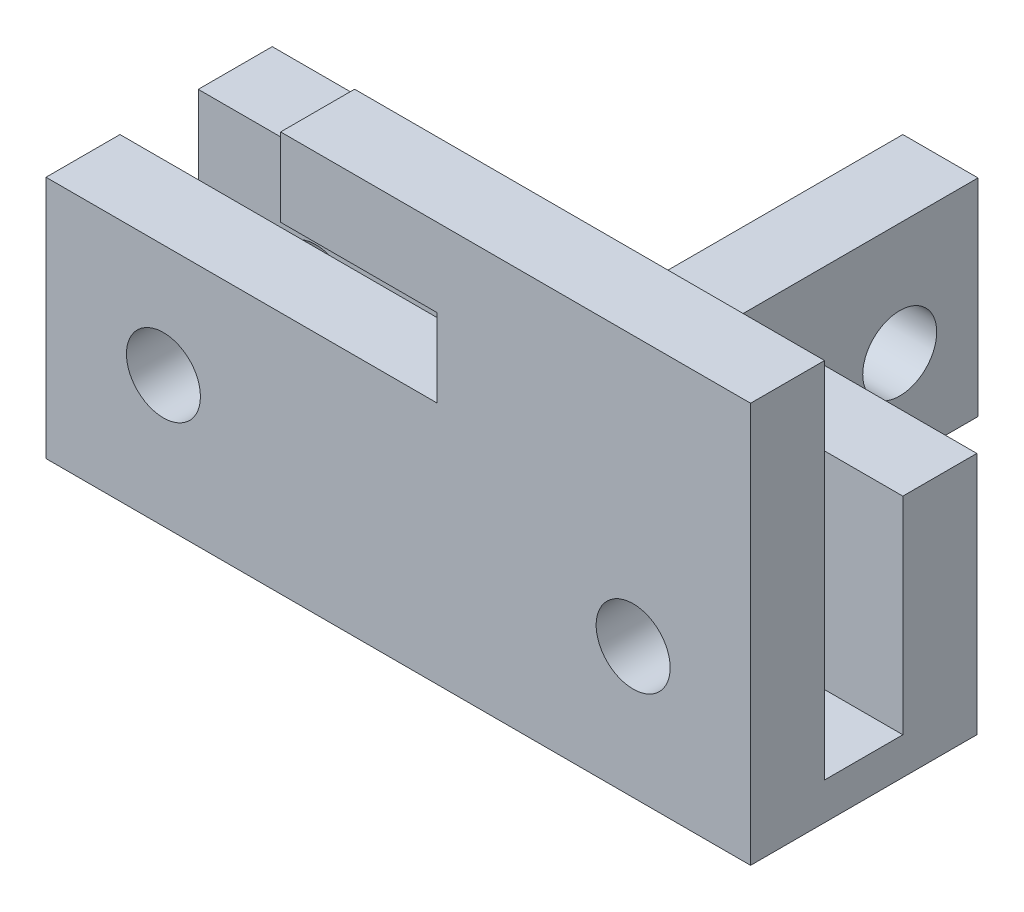
ISO-10303-21;
HEADER;
FILE_DESCRIPTION(('STEP AP214'),'2;1');
FILE_NAME('part.step','',(''),(''),'','','');
FILE_SCHEMA(('AUTOMOTIVE_DESIGN { 1 0 10303 214 1 1 1 1 }'));
ENDSEC;
DATA;
#1=APPLICATION_CONTEXT('core data for automotive mechanical design processes');
#2=APPLICATION_PROTOCOL_DEFINITION('international standard','automotive_design',2000,#1);
#3=PRODUCT_CONTEXT('',#1,'mechanical');
#4=PRODUCT('Part','Part','',(#3));
#5=PRODUCT_RELATED_PRODUCT_CATEGORY('part','',(#4));
#6=PRODUCT_DEFINITION_FORMATION('','',#4);
#7=PRODUCT_DEFINITION_CONTEXT('part definition',#1,'design');
#8=PRODUCT_DEFINITION('design','',#6,#7);
#9=PRODUCT_DEFINITION_SHAPE('','',#8);
#10=(LENGTH_UNIT() NAMED_UNIT(*) SI_UNIT(.MILLI.,.METRE.));
#11=(NAMED_UNIT(*) PLANE_ANGLE_UNIT() SI_UNIT($,.RADIAN.));
#12=(NAMED_UNIT(*) SI_UNIT($,.STERADIAN.) SOLID_ANGLE_UNIT());
#13=UNCERTAINTY_MEASURE_WITH_UNIT(LENGTH_MEASURE(1.E-05),#10,'distance_accuracy_value','');
#14=(GEOMETRIC_REPRESENTATION_CONTEXT(3) GLOBAL_UNCERTAINTY_ASSIGNED_CONTEXT((#13)) GLOBAL_UNIT_ASSIGNED_CONTEXT((#10,
#11,#12)) REPRESENTATION_CONTEXT('',''));
#15=CARTESIAN_POINT('',(0.,0.,0.));
#16=DIRECTION('',(0.,0.,1.));
#17=DIRECTION('',(1.,0.,0.));
#18=AXIS2_PLACEMENT_3D('',#15,#16,#17);
#19=CARTESIAN_POINT('',(14.2875,0.,-9.175));
#20=DIRECTION('',(0.,0.,1.));
#21=DIRECTION('',(0.,-1.,0.));
#22=AXIS2_PLACEMENT_3D('',#19,#20,#21);
#23=PLANE('',#22);
#24=CARTESIAN_POINT('',(-9.525,5.31,-9.175));
#25=DIRECTION('',(0.,0.,1.));
#26=DIRECTION('',(1.,0.,0.));
#27=AXIS2_PLACEMENT_3D('',#24,#25,#26);
#28=CIRCLE('',#27,1.5);
#29=CARTESIAN_POINT('',(-8.025,5.31,-9.175));
#30=VERTEX_POINT('',#29);
#31=EDGE_CURVE('E294',#30,#30,#28,.F.);
#32=ORIENTED_EDGE('',*,*,#31,.F.);
#33=EDGE_LOOP('',(#32));
#34=FACE_BOUND('',#33,.T.);
#35=CARTESIAN_POINT('',(9.525,5.31,-9.175));
#36=DIRECTION('',(0.,0.,1.));
#37=DIRECTION('',(1.,0.,0.));
#38=AXIS2_PLACEMENT_3D('',#35,#36,#37);
#39=CIRCLE('',#38,1.5);
#40=CARTESIAN_POINT('',(11.025,5.31,-9.175));
#41=VERTEX_POINT('',#40);
#42=EDGE_CURVE('E295',#41,#41,#39,.F.);
#43=ORIENTED_EDGE('',*,*,#42,.F.);
#44=EDGE_LOOP('',(#43));
#45=FACE_BOUND('',#44,.T.);
#46=DIRECTION('',(-1.,0.,0.));
#47=VECTOR('',#46,1.);
#48=CARTESIAN_POINT('',(4.6355,1.5,-9.175));
#49=LINE('',#48,#47);
#50=CARTESIAN_POINT('',(4.6355,1.5,-9.175));
#51=VERTEX_POINT('',#50);
#52=CARTESIAN_POINT('',(1.5875,1.5,-9.175));
#53=VERTEX_POINT('',#52);
#54=EDGE_CURVE('E264',#51,#53,#49,.T.);
#55=ORIENTED_EDGE('',*,*,#54,.F.);
#56=DIRECTION('',(0.,-1.,0.));
#57=VECTOR('',#56,1.);
#58=CARTESIAN_POINT('',(4.6355,9.882,-9.175));
#59=LINE('',#58,#57);
#60=CARTESIAN_POINT('',(4.6355,9.882,-9.175));
#61=VERTEX_POINT('',#60);
#62=EDGE_CURVE('E65',#61,#51,#59,.T.);
#63=ORIENTED_EDGE('',*,*,#62,.F.);
#64=DIRECTION('',(-1.,0.,0.));
#65=VECTOR('',#64,1.);
#66=CARTESIAN_POINT('',(14.2875,9.882,-9.175));
#67=LINE('',#66,#65);
#68=CARTESIAN_POINT('',(14.2875,9.882,-9.175));
#69=VERTEX_POINT('',#68);
#70=EDGE_CURVE('E386',#69,#61,#67,.T.);
#71=ORIENTED_EDGE('',*,*,#70,.F.);
#72=DIRECTION('',(0.,1.,0.));
#73=VECTOR('',#72,1.);
#74=CARTESIAN_POINT('',(14.2875,0.,-9.175));
#75=LINE('',#74,#73);
#76=CARTESIAN_POINT('',(14.2875,0.,-9.175));
#77=VERTEX_POINT('',#76);
#78=EDGE_CURVE('E330',#77,#69,#75,.T.);
#79=ORIENTED_EDGE('',*,*,#78,.F.);
#80=DIRECTION('',(-1.,0.,0.));
#81=VECTOR('',#80,1.);
#82=CARTESIAN_POINT('',(14.2875,0.,-9.175));
#83=LINE('',#82,#81);
#84=CARTESIAN_POINT('',(-14.2875,0.,-9.175));
#85=VERTEX_POINT('',#84);
#86=EDGE_CURVE('E389',#77,#85,#83,.T.);
#87=ORIENTED_EDGE('',*,*,#86,.T.);
#88=DIRECTION('',(0.,1.,0.));
#89=VECTOR('',#88,1.);
#90=CARTESIAN_POINT('',(-14.2875,0.,-9.175));
#91=LINE('',#90,#89);
#92=CARTESIAN_POINT('',(-14.2875,9.882,-9.175));
#93=VERTEX_POINT('',#92);
#94=EDGE_CURVE('E358',#85,#93,#91,.T.);
#95=ORIENTED_EDGE('',*,*,#94,.T.);
#96=CARTESIAN_POINT('',(-1.5875,9.882,-9.175));
#97=VERTEX_POINT('',#96);
#98=EDGE_CURVE('E385',#97,#93,#67,.T.);
#99=ORIENTED_EDGE('',*,*,#98,.F.);
#100=DIRECTION('',(0.,1.,0.));
#101=VECTOR('',#100,1.);
#102=CARTESIAN_POINT('',(-1.5875,9.882,-9.175));
#103=LINE('',#102,#101);
#104=CARTESIAN_POINT('',(-1.5875,1.5,-9.175));
#105=VERTEX_POINT('',#104);
#106=EDGE_CURVE('E269',#105,#97,#103,.T.);
#107=ORIENTED_EDGE('',*,*,#106,.F.);
#108=DIRECTION('',(-1.,0.,0.));
#109=VECTOR('',#108,1.);
#110=CARTESIAN_POINT('',(1.5875,1.5,-9.175));
#111=LINE('',#110,#109);
#112=EDGE_CURVE('E268',#53,#105,#111,.T.);
#113=ORIENTED_EDGE('',*,*,#112,.F.);
#114=EDGE_LOOP('',(#55,#63,#71,#79,#87,#95,#99,#107,#113));
#115=FACE_BOUND('',#114,.T.);
#116=ADVANCED_FACE('F47',(#34,#45,#115),#23,.F.);
#117=CARTESIAN_POINT('',(14.2875,9.882,0.));
#118=DIRECTION('',(0.,1.,0.));
#119=DIRECTION('',(0.,0.,1.));
#120=AXIS2_PLACEMENT_3D('',#117,#118,#119);
#121=PLANE('',#120);
#122=DIRECTION('',(0.,0.,-1.));
#123=VECTOR('',#122,1.);
#124=CARTESIAN_POINT('',(-1.5875,9.882,0.00100000000000273));
#125=LINE('',#124,#123);
#126=CARTESIAN_POINT('',(-1.5875,9.882,-6.175));
#127=VERTEX_POINT('',#126);
#128=EDGE_CURVE('E284',#127,#97,#125,.T.);
#129=ORIENTED_EDGE('',*,*,#128,.T.);
#130=ORIENTED_EDGE('',*,*,#98,.T.);
#131=DIRECTION('',(0.,0.,-1.));
#132=VECTOR('',#131,1.);
#133=CARTESIAN_POINT('',(-14.2875,9.882,0.));
#134=LINE('',#133,#132);
#135=CARTESIAN_POINT('',(-14.2875,9.882,-6.175));
#136=VERTEX_POINT('',#135);
#137=EDGE_CURVE('E362',#136,#93,#134,.T.);
#138=ORIENTED_EDGE('',*,*,#137,.F.);
#139=DIRECTION('',(-1.,0.,0.));
#140=VECTOR('',#139,1.);
#141=CARTESIAN_POINT('',(14.2875,9.882,-6.175));
#142=LINE('',#141,#140);
#143=EDGE_CURVE('E380',#127,#136,#142,.T.);
#144=ORIENTED_EDGE('',*,*,#143,.F.);
#145=EDGE_LOOP('',(#129,#130,#138,#144));
#146=FACE_BOUND('',#145,.T.);
#147=ADVANCED_FACE('F415',(#146),#121,.T.);
#148=CARTESIAN_POINT('',(14.2875,0.,-6.175));
#149=DIRECTION('',(0.,0.,1.));
#150=DIRECTION('',(0.,-1.,0.));
#151=AXIS2_PLACEMENT_3D('',#148,#149,#150);
#152=PLANE('',#151);
#153=DIRECTION('',(0.,1.,0.));
#154=VECTOR('',#153,1.);
#155=CARTESIAN_POINT('',(-1.5875,9.882,-6.175));
#156=LINE('',#155,#154);
#157=CARTESIAN_POINT('',(-1.5875,1.5,-6.175));
#158=VERTEX_POINT('',#157);
#159=EDGE_CURVE('E280',#158,#127,#156,.T.);
#160=ORIENTED_EDGE('',*,*,#159,.T.);
#161=ORIENTED_EDGE('',*,*,#143,.T.);
#162=DIRECTION('',(0.,1.,0.));
#163=VECTOR('',#162,1.);
#164=CARTESIAN_POINT('',(-14.2875,0.,-6.175));
#165=LINE('',#164,#163);
#166=CARTESIAN_POINT('',(-14.2875,1.5,-6.175));
#167=VERTEX_POINT('',#166);
#168=EDGE_CURVE('E366',#167,#136,#165,.T.);
#169=ORIENTED_EDGE('',*,*,#168,.F.);
#170=DIRECTION('',(-1.,0.,0.));
#171=VECTOR('',#170,1.);
#172=CARTESIAN_POINT('',(14.2875,1.5,-6.175));
#173=LINE('',#172,#171);
#174=EDGE_CURVE('E375',#158,#167,#173,.T.);
#175=ORIENTED_EDGE('',*,*,#174,.F.);
#176=EDGE_LOOP('',(#160,#161,#169,#175));
#177=FACE_BOUND('',#176,.T.);
#178=CARTESIAN_POINT('',(-9.525,5.31,-6.175));
#179=DIRECTION('',(0.,0.,1.));
#180=DIRECTION('',(0.,-1.,0.));
#181=AXIS2_PLACEMENT_3D('',#178,#179,#180);
#182=CIRCLE('',#181,1.5);
#183=CARTESIAN_POINT('',(-9.525,3.81,-6.175));
#184=VERTEX_POINT('',#183);
#185=EDGE_CURVE('E299',#184,#184,#182,.F.);
#186=ORIENTED_EDGE('',*,*,#185,.T.);
#187=EDGE_LOOP('',(#186));
#188=FACE_BOUND('',#187,.T.);
#189=ADVANCED_FACE('F402',(#177,#188),#152,.T.);
#190=CARTESIAN_POINT('',(14.2875,0.,-3.));
#191=DIRECTION('',(0.,0.,1.));
#192=DIRECTION('',(0.,-1.,0.));
#193=AXIS2_PLACEMENT_3D('',#190,#191,#192);
#194=PLANE('',#193);
#195=CARTESIAN_POINT('',(9.525,5.31,-3.));
#196=DIRECTION('',(0.,0.,1.));
#197=DIRECTION('',(0.,-1.,0.));
#198=AXIS2_PLACEMENT_3D('',#195,#196,#197);
#199=CIRCLE('',#198,1.5);
#200=CARTESIAN_POINT('',(9.525,3.81,-3.));
#201=VERTEX_POINT('',#200);
#202=EDGE_CURVE('E315',#201,#201,#199,.F.);
#203=ORIENTED_EDGE('',*,*,#202,.F.);
#204=EDGE_LOOP('',(#203));
#205=FACE_BOUND('',#204,.T.);
#206=CARTESIAN_POINT('',(-9.525,5.31,-3.));
#207=DIRECTION('',(0.,0.,1.));
#208=DIRECTION('',(0.,-1.,0.));
#209=AXIS2_PLACEMENT_3D('',#206,#207,#208);
#210=CIRCLE('',#209,1.5);
#211=CARTESIAN_POINT('',(-9.525,3.81,-3.));
#212=VERTEX_POINT('',#211);
#213=EDGE_CURVE('E311',#212,#212,#210,.F.);
#214=ORIENTED_EDGE('',*,*,#213,.F.);
#215=EDGE_LOOP('',(#214));
#216=FACE_BOUND('',#215,.T.);
#217=DIRECTION('',(0.,1.,0.));
#218=VECTOR('',#217,1.);
#219=CARTESIAN_POINT('',(-14.2875,0.,-3.));
#220=LINE('',#219,#218);
#221=CARTESIAN_POINT('',(-14.2875,1.5,-3.));
#222=VERTEX_POINT('',#221);
#223=CARTESIAN_POINT('',(-14.2875,9.882,-3.));
#224=VERTEX_POINT('',#223);
#225=EDGE_CURVE('E319',#222,#224,#220,.T.);
#226=ORIENTED_EDGE('',*,*,#225,.T.);
#227=DIRECTION('',(-1.,0.,0.));
#228=VECTOR('',#227,1.);
#229=CARTESIAN_POINT('',(14.2875,9.882,-3.));
#230=LINE('',#229,#228);
#231=CARTESIAN_POINT('',(1.5785,9.882,-3.));
#232=VERTEX_POINT('',#231);
#233=EDGE_CURVE('E12',#232,#224,#230,.T.);
#234=ORIENTED_EDGE('',*,*,#233,.F.);
#235=DIRECTION('',(0.,1.,0.));
#236=VECTOR('',#235,1.);
#237=CARTESIAN_POINT('',(1.5785,0.,-3.));
#238=LINE('',#237,#236);
#239=CARTESIAN_POINT('',(1.5785,13.057,-3.));
#240=VERTEX_POINT('',#239);
#241=EDGE_CURVE('E226',#232,#240,#238,.T.);
#242=ORIENTED_EDGE('',*,*,#241,.T.);
#243=DIRECTION('',(-1.,0.,0.));
#244=VECTOR('',#243,1.);
#245=CARTESIAN_POINT('',(0.,13.057,-3.));
#246=LINE('',#245,#244);
#247=CARTESIAN_POINT('',(-4.7715,13.057,-3.));
#248=VERTEX_POINT('',#247);
#249=EDGE_CURVE('E185',#240,#248,#246,.T.);
#250=ORIENTED_EDGE('',*,*,#249,.T.);
#251=DIRECTION('',(0.,-1.,0.));
#252=VECTOR('',#251,1.);
#253=CARTESIAN_POINT('',(-4.7715,0.,-3.));
#254=LINE('',#253,#252);
#255=CARTESIAN_POINT('',(-4.7715,16.232,-3.));
#256=VERTEX_POINT('',#255);
#257=EDGE_CURVE('E504',#256,#248,#254,.T.);
#258=ORIENTED_EDGE('',*,*,#257,.F.);
#259=DIRECTION('',(1.,0.,0.));
#260=VECTOR('',#259,1.);
#261=CARTESIAN_POINT('',(0.,16.232,-3.));
#262=LINE('',#261,#260);
#263=CARTESIAN_POINT('',(14.2875,16.232,-2.99999999999999));
#264=VERTEX_POINT('',#263);
#265=EDGE_CURVE('E216',#256,#264,#262,.T.);
#266=ORIENTED_EDGE('',*,*,#265,.T.);
#267=DIRECTION('',(0.,1.,0.));
#268=VECTOR('',#267,1.);
#269=CARTESIAN_POINT('',(14.2875,0.,-3.));
#270=LINE('',#269,#268);
#271=CARTESIAN_POINT('',(14.2875,1.5,-3.));
#272=VERTEX_POINT('',#271);
#273=EDGE_CURVE('E320',#272,#264,#270,.T.);
#274=ORIENTED_EDGE('',*,*,#273,.F.);
#275=DIRECTION('',(-1.,0.,0.));
#276=VECTOR('',#275,1.);
#277=CARTESIAN_POINT('',(14.2875,1.5,-3.));
#278=LINE('',#277,#276);
#279=EDGE_CURVE('E344',#272,#222,#278,.T.);
#280=ORIENTED_EDGE('',*,*,#279,.T.);
#281=EDGE_LOOP('',(#226,#234,#242,#250,#258,#266,#274,#280));
#282=FACE_BOUND('',#281,.T.);
#283=ADVANCED_FACE('F49',(#205,#216,#282),#194,.F.);
#284=CARTESIAN_POINT('',(14.2875,9.882,0.));
#285=DIRECTION('',(0.,-1.,0.));
#286=DIRECTION('',(0.,0.,-1.));
#287=AXIS2_PLACEMENT_3D('',#284,#285,#286);
#288=PLANE('',#287);
#289=DIRECTION('',(-1.,0.,0.));
#290=VECTOR('',#289,1.);
#291=CARTESIAN_POINT('',(14.2875,9.882,0.));
#292=LINE('',#291,#290);
#293=CARTESIAN_POINT('',(1.5785,9.882,0.));
#294=VERTEX_POINT('',#293);
#295=CARTESIAN_POINT('',(-14.2875,9.882,0.));
#296=VERTEX_POINT('',#295);
#297=EDGE_CURVE('E57',#294,#296,#292,.T.);
#298=ORIENTED_EDGE('',*,*,#297,.F.);
#299=DIRECTION('',(0.,0.,1.));
#300=VECTOR('',#299,1.);
#301=CARTESIAN_POINT('',(1.5785,9.882,-23.0890014933545));
#302=LINE('',#301,#300);
#303=EDGE_CURVE('E188',#232,#294,#302,.T.);
#304=ORIENTED_EDGE('',*,*,#303,.F.);
#305=ORIENTED_EDGE('',*,*,#233,.T.);
#306=DIRECTION('',(0.,0.,1.));
#307=VECTOR('',#306,1.);
#308=CARTESIAN_POINT('',(-14.2875,9.882,0.));
#309=LINE('',#308,#307);
#310=EDGE_CURVE('E348',#224,#296,#309,.T.);
#311=ORIENTED_EDGE('',*,*,#310,.T.);
#312=EDGE_LOOP('',(#298,#304,#305,#311));
#313=FACE_BOUND('',#312,.T.);
#314=ADVANCED_FACE('F485',(#313),#288,.F.);
#315=CARTESIAN_POINT('',(14.2875,0.,0.));
#316=DIRECTION('',(0.,0.,-1.));
#317=DIRECTION('',(0.,1.,0.));
#318=AXIS2_PLACEMENT_3D('',#315,#316,#317);
#319=PLANE('',#318);
#320=CARTESIAN_POINT('',(9.525,5.31,0.));
#321=DIRECTION('',(0.,0.,1.));
#322=DIRECTION('',(1.,0.,0.));
#323=AXIS2_PLACEMENT_3D('',#320,#321,#322);
#324=CIRCLE('',#323,1.5);
#325=CARTESIAN_POINT('',(11.025,5.31,0.));
#326=VERTEX_POINT('',#325);
#327=EDGE_CURVE('E300',#326,#326,#324,.F.);
#328=ORIENTED_EDGE('',*,*,#327,.T.);
#329=EDGE_LOOP('',(#328));
#330=FACE_BOUND('',#329,.T.);
#331=CARTESIAN_POINT('',(-9.525,5.31,0.));
#332=DIRECTION('',(0.,0.,1.));
#333=DIRECTION('',(1.,0.,0.));
#334=AXIS2_PLACEMENT_3D('',#331,#332,#333);
#335=CIRCLE('',#334,1.5);
#336=CARTESIAN_POINT('',(-8.025,5.31,0.));
#337=VERTEX_POINT('',#336);
#338=EDGE_CURVE('E304',#337,#337,#335,.F.);
#339=ORIENTED_EDGE('',*,*,#338,.T.);
#340=EDGE_LOOP('',(#339));
#341=FACE_BOUND('',#340,.T.);
#342=DIRECTION('',(0.,-1.,0.));
#343=VECTOR('',#342,1.);
#344=CARTESIAN_POINT('',(-14.2875,0.,0.));
#345=LINE('',#344,#343);
#346=CARTESIAN_POINT('',(-14.2875,0.,0.));
#347=VERTEX_POINT('',#346);
#348=EDGE_CURVE('E352',#296,#347,#345,.T.);
#349=ORIENTED_EDGE('',*,*,#348,.T.);
#350=DIRECTION('',(-1.,0.,0.));
#351=VECTOR('',#350,1.);
#352=CARTESIAN_POINT('',(14.2875,0.,0.));
#353=LINE('',#352,#351);
#354=CARTESIAN_POINT('',(14.2875,0.,0.));
#355=VERTEX_POINT('',#354);
#356=EDGE_CURVE('E393',#355,#347,#353,.T.);
#357=ORIENTED_EDGE('',*,*,#356,.F.);
#358=DIRECTION('',(0.,-1.,0.));
#359=VECTOR('',#358,1.);
#360=CARTESIAN_POINT('',(14.2875,0.,0.));
#361=LINE('',#360,#359);
#362=CARTESIAN_POINT('',(14.2875,16.232,0.));
#363=VERTEX_POINT('',#362);
#364=EDGE_CURVE('E323',#363,#355,#361,.T.);
#365=ORIENTED_EDGE('',*,*,#364,.F.);
#366=DIRECTION('',(-1.,0.,0.));
#367=VECTOR('',#366,1.);
#368=CARTESIAN_POINT('',(0.,16.232,0.));
#369=LINE('',#368,#367);
#370=CARTESIAN_POINT('',(-4.7715,16.232,0.));
#371=VERTEX_POINT('',#370);
#372=EDGE_CURVE('E198',#363,#371,#369,.T.);
#373=ORIENTED_EDGE('',*,*,#372,.T.);
#374=DIRECTION('',(0.,1.,0.));
#375=VECTOR('',#374,1.);
#376=CARTESIAN_POINT('',(-4.7715,0.,0.));
#377=LINE('',#376,#375);
#378=CARTESIAN_POINT('',(-4.7715,13.057,0.));
#379=VERTEX_POINT('',#378);
#380=EDGE_CURVE('E189',#379,#371,#377,.T.);
#381=ORIENTED_EDGE('',*,*,#380,.F.);
#382=DIRECTION('',(1.,0.,0.));
#383=VECTOR('',#382,1.);
#384=CARTESIAN_POINT('',(0.,13.057,0.));
#385=LINE('',#384,#383);
#386=CARTESIAN_POINT('',(1.5785,13.057,0.));
#387=VERTEX_POINT('',#386);
#388=EDGE_CURVE('E184',#379,#387,#385,.T.);
#389=ORIENTED_EDGE('',*,*,#388,.T.);
#390=DIRECTION('',(0.,-1.,0.));
#391=VECTOR('',#390,1.);
#392=CARTESIAN_POINT('',(1.5785,0.,0.));
#393=LINE('',#392,#391);
#394=EDGE_CURVE('E192',#387,#294,#393,.T.);
#395=ORIENTED_EDGE('',*,*,#394,.T.);
#396=ORIENTED_EDGE('',*,*,#297,.T.);
#397=EDGE_LOOP('',(#349,#357,#365,#373,#381,#389,#395,#396));
#398=FACE_BOUND('',#397,.T.);
#399=ADVANCED_FACE('F201',(#330,#341,#398),#319,.F.);
#400=CARTESIAN_POINT('',(14.2875,0.,0.));
#401=DIRECTION('',(0.,1.,0.));
#402=DIRECTION('',(0.,0.,1.));
#403=AXIS2_PLACEMENT_3D('',#400,#401,#402);
#404=PLANE('',#403);
#405=DIRECTION('',(0.,0.,-1.));
#406=VECTOR('',#405,1.);
#407=CARTESIAN_POINT('',(-14.2875,0.,0.));
#408=LINE('',#407,#406);
#409=EDGE_CURVE('E355',#347,#85,#408,.T.);
#410=ORIENTED_EDGE('',*,*,#409,.T.);
#411=ORIENTED_EDGE('',*,*,#86,.F.);
#412=DIRECTION('',(0.,0.,-1.));
#413=VECTOR('',#412,1.);
#414=CARTESIAN_POINT('',(14.2875,0.,0.));
#415=LINE('',#414,#413);
#416=EDGE_CURVE('E327',#355,#77,#415,.T.);
#417=ORIENTED_EDGE('',*,*,#416,.F.);
#418=ORIENTED_EDGE('',*,*,#356,.T.);
#419=EDGE_LOOP('',(#410,#411,#417,#418));
#420=FACE_BOUND('',#419,.T.);
#421=ADVANCED_FACE('F444',(#420),#404,.F.);
#422=DIRECTION('',(0.,0.,-1.));
#423=VECTOR('',#422,1.);
#424=CARTESIAN_POINT('',(1.5875,9.882,0.00100000000000273));
#425=LINE('',#424,#423);
#426=CARTESIAN_POINT('',(1.5875,9.882,-6.175));
#427=VERTEX_POINT('',#426);
#428=CARTESIAN_POINT('',(1.5875,9.882,-18.875));
#429=VERTEX_POINT('',#428);
#430=EDGE_CURVE('E279',#427,#429,#425,.T.);
#431=ORIENTED_EDGE('',*,*,#430,.F.);
#432=CARTESIAN_POINT('',(14.2875,9.882,-6.175));
#433=VERTEX_POINT('',#432);
#434=EDGE_CURVE('E381',#433,#427,#142,.T.);
#435=ORIENTED_EDGE('',*,*,#434,.F.);
#436=DIRECTION('',(0.,0.,-1.));
#437=VECTOR('',#436,1.);
#438=CARTESIAN_POINT('',(14.2875,9.882,0.));
#439=LINE('',#438,#437);
#440=EDGE_CURVE('E333',#433,#69,#439,.T.);
#441=ORIENTED_EDGE('',*,*,#440,.T.);
#442=ORIENTED_EDGE('',*,*,#70,.T.);
#443=DIRECTION('',(0.,0.,1.));
#444=VECTOR('',#443,1.);
#445=CARTESIAN_POINT('',(4.6355,9.882,-9.175));
#446=LINE('',#445,#444);
#447=CARTESIAN_POINT('',(4.6355,9.882,-18.875));
#448=VERTEX_POINT('',#447);
#449=EDGE_CURVE('E247',#448,#61,#446,.T.);
#450=ORIENTED_EDGE('',*,*,#449,.F.);
#451=DIRECTION('',(-1.,0.,0.));
#452=VECTOR('',#451,1.);
#453=CARTESIAN_POINT('',(4.6355,9.882,-18.875));
#454=LINE('',#453,#452);
#455=EDGE_CURVE('E251',#448,#429,#454,.T.);
#456=ORIENTED_EDGE('',*,*,#455,.T.);
#457=EDGE_LOOP('',(#431,#435,#441,#442,#450,#456));
#458=FACE_BOUND('',#457,.T.);
#459=ADVANCED_FACE('F433',(#458),#121,.T.);
#460=DIRECTION('',(0.,-1.,0.));
#461=VECTOR('',#460,1.);
#462=CARTESIAN_POINT('',(1.5875,9.882,-6.175));
#463=LINE('',#462,#461);
#464=CARTESIAN_POINT('',(1.5875,1.5,-6.175));
#465=VERTEX_POINT('',#464);
#466=EDGE_CURVE('E274',#427,#465,#463,.T.);
#467=ORIENTED_EDGE('',*,*,#466,.T.);
#468=CARTESIAN_POINT('',(14.2875,1.5,-6.175));
#469=VERTEX_POINT('',#468);
#470=EDGE_CURVE('E376',#469,#465,#173,.T.);
#471=ORIENTED_EDGE('',*,*,#470,.F.);
#472=DIRECTION('',(0.,1.,0.));
#473=VECTOR('',#472,1.);
#474=CARTESIAN_POINT('',(14.2875,0.,-6.175));
#475=LINE('',#474,#473);
#476=EDGE_CURVE('E337',#469,#433,#475,.T.);
#477=ORIENTED_EDGE('',*,*,#476,.T.);
#478=ORIENTED_EDGE('',*,*,#434,.T.);
#479=EDGE_LOOP('',(#467,#471,#477,#478));
#480=FACE_BOUND('',#479,.T.);
#481=CARTESIAN_POINT('',(9.525,5.31,-6.175));
#482=DIRECTION('',(0.,0.,1.));
#483=DIRECTION('',(0.,-1.,0.));
#484=AXIS2_PLACEMENT_3D('',#481,#482,#483);
#485=CIRCLE('',#484,1.5);
#486=CARTESIAN_POINT('',(9.525,3.81,-6.175));
#487=VERTEX_POINT('',#486);
#488=EDGE_CURVE('E51',#487,#487,#485,.F.);
#489=ORIENTED_EDGE('',*,*,#488,.T.);
#490=EDGE_LOOP('',(#489));
#491=FACE_BOUND('',#490,.T.);
#492=ADVANCED_FACE('F460',(#480,#491),#152,.T.);
#493=CARTESIAN_POINT('',(14.2875,1.5,0.));
#494=DIRECTION('',(0.,-1.,0.));
#495=DIRECTION('',(0.,0.,-1.));
#496=AXIS2_PLACEMENT_3D('',#493,#494,#495);
#497=PLANE('',#496);
#498=DIRECTION('',(0.,0.,1.));
#499=VECTOR('',#498,1.);
#500=CARTESIAN_POINT('',(-14.2875,1.5,0.));
#501=LINE('',#500,#499);
#502=EDGE_CURVE('E324',#167,#222,#501,.T.);
#503=ORIENTED_EDGE('',*,*,#502,.T.);
#504=ORIENTED_EDGE('',*,*,#279,.F.);
#505=DIRECTION('',(0.,0.,1.));
#506=VECTOR('',#505,1.);
#507=CARTESIAN_POINT('',(14.2875,1.5,0.));
#508=LINE('',#507,#506);
#509=EDGE_CURVE('E341',#469,#272,#508,.T.);
#510=ORIENTED_EDGE('',*,*,#509,.F.);
#511=ORIENTED_EDGE('',*,*,#470,.T.);
#512=DIRECTION('',(0.,0.,-1.));
#513=VECTOR('',#512,1.);
#514=CARTESIAN_POINT('',(1.5875,1.5,0.00100000000000273));
#515=LINE('',#514,#513);
#516=EDGE_CURVE('E278',#465,#53,#515,.T.);
#517=ORIENTED_EDGE('',*,*,#516,.T.);
#518=ORIENTED_EDGE('',*,*,#112,.T.);
#519=DIRECTION('',(0.,0.,-1.));
#520=VECTOR('',#519,1.);
#521=CARTESIAN_POINT('',(-1.5875,1.5,0.00100000000000273));
#522=LINE('',#521,#520);
#523=EDGE_CURVE('E73',#158,#105,#522,.T.);
#524=ORIENTED_EDGE('',*,*,#523,.F.);
#525=ORIENTED_EDGE('',*,*,#174,.T.);
#526=EDGE_LOOP('',(#503,#504,#510,#511,#517,#518,#524,#525));
#527=FACE_BOUND('',#526,.T.);
#528=ADVANCED_FACE('F542',(#527),#497,.F.);
#529=CARTESIAN_POINT('',(14.2875,0.,0.));
#530=DIRECTION('',(1.,0.,0.));
#531=DIRECTION('',(0.,0.,-1.));
#532=AXIS2_PLACEMENT_3D('',#529,#530,#531);
#533=PLANE('',#532);
#534=ORIENTED_EDGE('',*,*,#273,.T.);
#535=DIRECTION('',(0.,0.,1.));
#536=VECTOR('',#535,1.);
#537=CARTESIAN_POINT('',(14.2875,16.232,-23.0890014933545));
#538=LINE('',#537,#536);
#539=EDGE_CURVE('E220',#264,#363,#538,.T.);
#540=ORIENTED_EDGE('',*,*,#539,.T.);
#541=ORIENTED_EDGE('',*,*,#364,.T.);
#542=ORIENTED_EDGE('',*,*,#416,.T.);
#543=ORIENTED_EDGE('',*,*,#78,.T.);
#544=ORIENTED_EDGE('',*,*,#440,.F.);
#545=ORIENTED_EDGE('',*,*,#476,.F.);
#546=ORIENTED_EDGE('',*,*,#509,.T.);
#547=EDGE_LOOP('',(#534,#540,#541,#542,#543,#544,#545,#546));
#548=FACE_BOUND('',#547,.T.);
#549=ADVANCED_FACE('F439',(#548),#533,.T.);
#550=CARTESIAN_POINT('',(-14.2875,0.,0.));
#551=DIRECTION('',(1.,0.,0.));
#552=DIRECTION('',(0.,0.,-1.));
#553=AXIS2_PLACEMENT_3D('',#550,#551,#552);
#554=PLANE('',#553);
#555=ORIENTED_EDGE('',*,*,#225,.F.);
#556=ORIENTED_EDGE('',*,*,#502,.F.);
#557=ORIENTED_EDGE('',*,*,#168,.T.);
#558=ORIENTED_EDGE('',*,*,#137,.T.);
#559=ORIENTED_EDGE('',*,*,#94,.F.);
#560=ORIENTED_EDGE('',*,*,#409,.F.);
#561=ORIENTED_EDGE('',*,*,#348,.F.);
#562=ORIENTED_EDGE('',*,*,#310,.F.);
#563=EDGE_LOOP('',(#555,#556,#557,#558,#559,#560,#561,#562));
#564=FACE_BOUND('',#563,.T.);
#565=ADVANCED_FACE('F408',(#564),#554,.F.);
#566=CARTESIAN_POINT('',(-9.525,5.31,-9.175));
#567=DIRECTION('',(0.,0.,1.));
#568=DIRECTION('',(1.,0.,0.));
#569=AXIS2_PLACEMENT_3D('',#566,#567,#568);
#570=CYLINDRICAL_SURFACE('',#569,1.5);
#571=ORIENTED_EDGE('',*,*,#185,.F.);
#572=EDGE_LOOP('',(#571));
#573=FACE_BOUND('',#572,.T.);
#574=ORIENTED_EDGE('',*,*,#31,.T.);
#575=EDGE_LOOP('',(#574));
#576=FACE_BOUND('',#575,.T.);
#577=ADVANCED_FACE('F404',(#573,#576),#570,.F.);
#578=CARTESIAN_POINT('',(9.525,5.31,-9.175));
#579=DIRECTION('',(0.,0.,1.));
#580=DIRECTION('',(1.,0.,0.));
#581=AXIS2_PLACEMENT_3D('',#578,#579,#580);
#582=CYLINDRICAL_SURFACE('',#581,1.5);
#583=ORIENTED_EDGE('',*,*,#488,.F.);
#584=EDGE_LOOP('',(#583));
#585=FACE_BOUND('',#584,.T.);
#586=ORIENTED_EDGE('',*,*,#42,.T.);
#587=EDGE_LOOP('',(#586));
#588=FACE_BOUND('',#587,.T.);
#589=ADVANCED_FACE('F407',(#585,#588),#582,.F.);
#590=ORIENTED_EDGE('',*,*,#338,.F.);
#591=EDGE_LOOP('',(#590));
#592=FACE_BOUND('',#591,.T.);
#593=ORIENTED_EDGE('',*,*,#213,.T.);
#594=EDGE_LOOP('',(#593));
#595=FACE_BOUND('',#594,.T.);
#596=ADVANCED_FACE('F410',(#592,#595),#570,.F.);
#597=ORIENTED_EDGE('',*,*,#327,.F.);
#598=EDGE_LOOP('',(#597));
#599=FACE_BOUND('',#598,.T.);
#600=ORIENTED_EDGE('',*,*,#202,.T.);
#601=EDGE_LOOP('',(#600));
#602=FACE_BOUND('',#601,.T.);
#603=ADVANCED_FACE('F465',(#599,#602),#582,.F.);
#604=CARTESIAN_POINT('',(-1.5875,9.882,0.00100000000000273));
#605=DIRECTION('',(-1.,0.,0.));
#606=DIRECTION('',(0.,-1.,0.));
#607=AXIS2_PLACEMENT_3D('',#604,#605,#606);
#608=PLANE('',#607);
#609=ORIENTED_EDGE('',*,*,#523,.T.);
#610=ORIENTED_EDGE('',*,*,#106,.T.);
#611=ORIENTED_EDGE('',*,*,#128,.F.);
#612=ORIENTED_EDGE('',*,*,#159,.F.);
#613=EDGE_LOOP('',(#609,#610,#611,#612));
#614=FACE_BOUND('',#613,.T.);
#615=ADVANCED_FACE('F472',(#614),#608,.F.);
#616=CARTESIAN_POINT('',(1.5875,9.882,0.00100000000000273));
#617=DIRECTION('',(1.,0.,0.));
#618=DIRECTION('',(0.,1.,0.));
#619=AXIS2_PLACEMENT_3D('',#616,#617,#618);
#620=PLANE('',#619);
#621=ORIENTED_EDGE('',*,*,#430,.T.);
#622=DIRECTION('',(0.,1.,0.));
#623=VECTOR('',#622,1.);
#624=CARTESIAN_POINT('',(1.5875,9.882,-18.875));
#625=LINE('',#624,#623);
#626=CARTESIAN_POINT('',(1.5875,1.5,-18.875));
#627=VERTEX_POINT('',#626);
#628=EDGE_CURVE('E241',#627,#429,#625,.T.);
#629=ORIENTED_EDGE('',*,*,#628,.F.);
#630=DIRECTION('',(0.,0.,-1.));
#631=VECTOR('',#630,1.);
#632=CARTESIAN_POINT('',(1.5875,1.5,-9.175));
#633=LINE('',#632,#631);
#634=EDGE_CURVE('E234',#53,#627,#633,.T.);
#635=ORIENTED_EDGE('',*,*,#634,.F.);
#636=ORIENTED_EDGE('',*,*,#516,.F.);
#637=ORIENTED_EDGE('',*,*,#466,.F.);
#638=EDGE_LOOP('',(#621,#629,#635,#636,#637));
#639=FACE_BOUND('',#638,.T.);
#640=CARTESIAN_POINT('',(1.5875,5.31,-15.7));
#641=DIRECTION('',(1.,0.,0.));
#642=DIRECTION('',(0.,0.,-1.));
#643=AXIS2_PLACEMENT_3D('',#640,#641,#642);
#644=CIRCLE('',#643,1.5);
#645=CARTESIAN_POINT('',(1.5875,5.31,-14.2));
#646=VERTEX_POINT('',#645);
#647=EDGE_CURVE('E229',#646,#646,#644,.T.);
#648=ORIENTED_EDGE('',*,*,#647,.T.);
#649=EDGE_LOOP('',(#648));
#650=FACE_BOUND('',#649,.T.);
#651=ADVANCED_FACE('F477',(#639,#650),#620,.F.);
#652=CARTESIAN_POINT('',(4.6355,0.,0.));
#653=DIRECTION('',(1.,0.,0.));
#654=DIRECTION('',(0.,0.,-1.));
#655=AXIS2_PLACEMENT_3D('',#652,#653,#654);
#656=PLANE('',#655);
#657=ORIENTED_EDGE('',*,*,#62,.T.);
#658=DIRECTION('',(0.,0.,-1.));
#659=VECTOR('',#658,1.);
#660=CARTESIAN_POINT('',(4.6355,1.5,-9.175));
#661=LINE('',#660,#659);
#662=CARTESIAN_POINT('',(4.6355,1.5,-18.875));
#663=VERTEX_POINT('',#662);
#664=EDGE_CURVE('E240',#51,#663,#661,.T.);
#665=ORIENTED_EDGE('',*,*,#664,.T.);
#666=DIRECTION('',(0.,1.,0.));
#667=VECTOR('',#666,1.);
#668=CARTESIAN_POINT('',(4.6355,9.882,-18.875));
#669=LINE('',#668,#667);
#670=EDGE_CURVE('E244',#663,#448,#669,.T.);
#671=ORIENTED_EDGE('',*,*,#670,.T.);
#672=ORIENTED_EDGE('',*,*,#449,.T.);
#673=EDGE_LOOP('',(#657,#665,#671,#672));
#674=FACE_BOUND('',#673,.T.);
#675=CARTESIAN_POINT('',(4.6355,5.31,-15.7));
#676=DIRECTION('',(1.,0.,0.));
#677=DIRECTION('',(0.,0.,-1.));
#678=AXIS2_PLACEMENT_3D('',#675,#676,#677);
#679=CIRCLE('',#678,1.5);
#680=CARTESIAN_POINT('',(4.6355,5.31,-14.2));
#681=VERTEX_POINT('',#680);
#682=EDGE_CURVE('E230',#681,#681,#679,.T.);
#683=ORIENTED_EDGE('',*,*,#682,.F.);
#684=EDGE_LOOP('',(#683));
#685=FACE_BOUND('',#684,.T.);
#686=ADVANCED_FACE('F427',(#674,#685),#656,.T.);
#687=CARTESIAN_POINT('',(4.6355,1.5,-9.175));
#688=DIRECTION('',(0.,1.,0.));
#689=DIRECTION('',(0.,0.,1.));
#690=AXIS2_PLACEMENT_3D('',#687,#688,#689);
#691=PLANE('',#690);
#692=ORIENTED_EDGE('',*,*,#634,.T.);
#693=DIRECTION('',(-1.,0.,0.));
#694=VECTOR('',#693,1.);
#695=CARTESIAN_POINT('',(4.6355,1.5,-18.875));
#696=LINE('',#695,#694);
#697=EDGE_CURVE('E260',#663,#627,#696,.T.);
#698=ORIENTED_EDGE('',*,*,#697,.F.);
#699=ORIENTED_EDGE('',*,*,#664,.F.);
#700=ORIENTED_EDGE('',*,*,#54,.T.);
#701=EDGE_LOOP('',(#692,#698,#699,#700));
#702=FACE_BOUND('',#701,.T.);
#703=ADVANCED_FACE('F424',(#702),#691,.F.);
#704=CARTESIAN_POINT('',(4.6355,9.882,-18.875));
#705=DIRECTION('',(0.,0.,1.));
#706=DIRECTION('',(1.,0.,0.));
#707=AXIS2_PLACEMENT_3D('',#704,#705,#706);
#708=PLANE('',#707);
#709=ORIENTED_EDGE('',*,*,#628,.T.);
#710=ORIENTED_EDGE('',*,*,#455,.F.);
#711=ORIENTED_EDGE('',*,*,#670,.F.);
#712=ORIENTED_EDGE('',*,*,#697,.T.);
#713=EDGE_LOOP('',(#709,#710,#711,#712));
#714=FACE_BOUND('',#713,.T.);
#715=ADVANCED_FACE('F523',(#714),#708,.F.);
#716=CARTESIAN_POINT('',(4.6355,5.31,-15.7));
#717=DIRECTION('',(-1.,0.,0.));
#718=DIRECTION('',(0.,0.,1.));
#719=AXIS2_PLACEMENT_3D('',#716,#717,#718);
#720=CYLINDRICAL_SURFACE('',#719,1.5);
#721=CARTESIAN_POINT('',(4.6355,5.31,-14.2));
#722=CARTESIAN_POINT('',(4.60375,5.31,-14.2));
#723=CARTESIAN_POINT('',(4.572,5.31,-14.2));
#724=CARTESIAN_POINT('',(4.5085,5.31,-14.2));
#725=CARTESIAN_POINT('',(4.47675,5.31,-14.2));
#726=CARTESIAN_POINT('',(4.41325,5.31,-14.2));
#727=CARTESIAN_POINT('',(4.3815,5.31,-14.2));
#728=CARTESIAN_POINT('',(4.318,5.31,-14.2));
#729=CARTESIAN_POINT('',(4.28625,5.31,-14.2));
#730=CARTESIAN_POINT('',(4.22275,5.31,-14.2));
#731=CARTESIAN_POINT('',(4.191,5.31,-14.2));
#732=CARTESIAN_POINT('',(4.1275,5.31,-14.2));
#733=CARTESIAN_POINT('',(4.09575,5.31,-14.2));
#734=CARTESIAN_POINT('',(4.03225,5.31,-14.2));
#735=CARTESIAN_POINT('',(4.0005,5.31,-14.2));
#736=CARTESIAN_POINT('',(3.937,5.31,-14.2));
#737=CARTESIAN_POINT('',(3.90525,5.31,-14.2));
#738=CARTESIAN_POINT('',(3.84175,5.31,-14.2));
#739=CARTESIAN_POINT('',(3.81,5.31,-14.2));
#740=CARTESIAN_POINT('',(3.7465,5.31,-14.2));
#741=CARTESIAN_POINT('',(3.71475,5.31,-14.2));
#742=CARTESIAN_POINT('',(3.65125,5.31,-14.2));
#743=CARTESIAN_POINT('',(3.6195,5.31,-14.2));
#744=CARTESIAN_POINT('',(3.556,5.31,-14.2));
#745=CARTESIAN_POINT('',(3.52425,5.31,-14.2));
#746=CARTESIAN_POINT('',(3.46075,5.31,-14.2));
#747=CARTESIAN_POINT('',(3.429,5.31,-14.2));
#748=CARTESIAN_POINT('',(3.3655,5.31,-14.2));
#749=CARTESIAN_POINT('',(3.33375,5.31,-14.2));
#750=CARTESIAN_POINT('',(3.27025,5.31,-14.2));
#751=CARTESIAN_POINT('',(3.2385,5.31,-14.2));
#752=CARTESIAN_POINT('',(3.175,5.31,-14.2));
#753=CARTESIAN_POINT('',(3.14325,5.31,-14.2));
#754=CARTESIAN_POINT('',(3.07975,5.31,-14.2));
#755=CARTESIAN_POINT('',(3.048,5.31,-14.2));
#756=CARTESIAN_POINT('',(2.9845,5.31,-14.2));
#757=CARTESIAN_POINT('',(2.95275,5.31,-14.2));
#758=CARTESIAN_POINT('',(2.88925,5.31,-14.2));
#759=CARTESIAN_POINT('',(2.8575,5.31,-14.2));
#760=CARTESIAN_POINT('',(2.794,5.31,-14.2));
#761=CARTESIAN_POINT('',(2.76225,5.31,-14.2));
#762=CARTESIAN_POINT('',(2.69875,5.31,-14.2));
#763=CARTESIAN_POINT('',(2.667,5.31,-14.2));
#764=CARTESIAN_POINT('',(2.6035,5.31,-14.2));
#765=CARTESIAN_POINT('',(2.57175,5.31,-14.2));
#766=CARTESIAN_POINT('',(2.50825,5.31,-14.2));
#767=CARTESIAN_POINT('',(2.4765,5.31,-14.2));
#768=CARTESIAN_POINT('',(2.413,5.31,-14.2));
#769=CARTESIAN_POINT('',(2.38125,5.31,-14.2));
#770=CARTESIAN_POINT('',(2.31775,5.31,-14.2));
#771=CARTESIAN_POINT('',(2.286,5.31,-14.2));
#772=CARTESIAN_POINT('',(2.2225,5.31,-14.2));
#773=CARTESIAN_POINT('',(2.19075,5.31,-14.2));
#774=CARTESIAN_POINT('',(2.12725,5.31,-14.2));
#775=CARTESIAN_POINT('',(2.0955,5.31,-14.2));
#776=CARTESIAN_POINT('',(2.032,5.31,-14.2));
#777=CARTESIAN_POINT('',(2.00025,5.31,-14.2));
#778=CARTESIAN_POINT('',(1.93675,5.31,-14.2));
#779=CARTESIAN_POINT('',(1.905,5.31,-14.2));
#780=CARTESIAN_POINT('',(1.8415,5.31,-14.2));
#781=CARTESIAN_POINT('',(1.80975,5.31,-14.2));
#782=CARTESIAN_POINT('',(1.74625,5.31,-14.2));
#783=CARTESIAN_POINT('',(1.7145,5.31,-14.2));
#784=CARTESIAN_POINT('',(1.651,5.31,-14.2));
#785=CARTESIAN_POINT('',(1.61925,5.31,-14.2));
#786=CARTESIAN_POINT('',(1.5875,5.31,-14.2));
#787=B_SPLINE_CURVE_WITH_KNOTS('',3,(#721,#722,#723,#724,#725,#726,#727,#728,#729,#730,#731,
#732,#733,#734,#735,#736,#737,#738,#739,#740,#741,#742,#743,#744,#745,#746,#747,#748,#749,#750,
#751,#752,#753,#754,#755,#756,#757,#758,#759,#760,#761,#762,#763,#764,#765,#766,#767,#768,#769,
#770,#771,#772,#773,#774,#775,#776,#777,#778,#779,#780,#781,#782,#783,#784,#785,#786),
.UNSPECIFIED.,.F.,.F.,(4,2,2,2,2,2,2,2,2,2,2,2,2,2,2,2,2,2,2,2,2,2,2,2,2,2,2,2,2,2,2,2,4),(0.,
0.0952500000000007,0.190500000000001,0.28575,0.381,0.47625,0.5715,0.666750000000001,
0.762000000000001,0.85725,0.9525,1.04775,1.143,1.23825,1.3335,1.42875,1.524,1.61925,1.7145,
1.80975,1.905,2.00025,2.0955,2.19075,2.286,2.38125,2.4765,2.57175,2.667,2.76225,2.8575,2.95275,
3.048),.UNSPECIFIED.);
#788=EDGE_CURVE('BSEAM516',#681,#646,#787,.T.);
#789=ORIENTED_EDGE('',*,*,#682,.T.);
#790=ORIENTED_EDGE('',*,*,#647,.F.);
#791=ORIENTED_EDGE('',*,*,#788,.T.);
#792=ORIENTED_EDGE('',*,*,#788,.F.);
#793=EDGE_LOOP('',(#789,#791,#790,#792));
#794=FACE_BOUND('',#793,.T.);
#795=ADVANCED_FACE('F516',(#794),#720,.F.);
#796=CARTESIAN_POINT('',(0.,13.057,-23.0890014933545));
#797=DIRECTION('',(0.,-1.,0.));
#798=DIRECTION('',(0.,0.,-1.));
#799=AXIS2_PLACEMENT_3D('',#796,#797,#798);
#800=PLANE('',#799);
#801=ORIENTED_EDGE('',*,*,#249,.F.);
#802=DIRECTION('',(0.,0.,1.));
#803=VECTOR('',#802,1.);
#804=CARTESIAN_POINT('',(1.5785,13.057,-23.0890014933545));
#805=LINE('',#804,#803);
#806=EDGE_CURVE('E179',#240,#387,#805,.T.);
#807=ORIENTED_EDGE('',*,*,#806,.T.);
#808=ORIENTED_EDGE('',*,*,#388,.F.);
#809=DIRECTION('',(0.,0.,1.));
#810=VECTOR('',#809,1.);
#811=CARTESIAN_POINT('',(-4.7715,13.057,-23.0890014933545));
#812=LINE('',#811,#810);
#813=EDGE_CURVE('E213',#248,#379,#812,.T.);
#814=ORIENTED_EDGE('',*,*,#813,.F.);
#815=EDGE_LOOP('',(#801,#807,#808,#814));
#816=FACE_BOUND('',#815,.T.);
#817=ADVANCED_FACE('F181',(#816),#800,.T.);
#818=CARTESIAN_POINT('',(-4.7715,0.,-23.0890014933545));
#819=DIRECTION('',(1.,0.,0.));
#820=DIRECTION('',(0.,0.,-1.));
#821=AXIS2_PLACEMENT_3D('',#818,#819,#820);
#822=PLANE('',#821);
#823=DIRECTION('',(0.,0.,1.));
#824=VECTOR('',#823,1.);
#825=CARTESIAN_POINT('',(-4.7715,16.232,-23.0890014933545));
#826=LINE('',#825,#824);
#827=EDGE_CURVE('E217',#256,#371,#826,.T.);
#828=ORIENTED_EDGE('',*,*,#827,.F.);
#829=ORIENTED_EDGE('',*,*,#257,.T.);
#830=ORIENTED_EDGE('',*,*,#813,.T.);
#831=ORIENTED_EDGE('',*,*,#380,.T.);
#832=EDGE_LOOP('',(#828,#829,#830,#831));
#833=FACE_BOUND('',#832,.T.);
#834=ADVANCED_FACE('F503',(#833),#822,.F.);
#835=CARTESIAN_POINT('',(0.,16.232,-23.0890014933545));
#836=DIRECTION('',(0.,1.,0.));
#837=DIRECTION('',(-1.,0.,0.));
#838=AXIS2_PLACEMENT_3D('',#835,#836,#837);
#839=PLANE('',#838);
#840=ORIENTED_EDGE('',*,*,#265,.F.);
#841=ORIENTED_EDGE('',*,*,#827,.T.);
#842=ORIENTED_EDGE('',*,*,#372,.F.);
#843=ORIENTED_EDGE('',*,*,#539,.F.);
#844=EDGE_LOOP('',(#840,#841,#842,#843));
#845=FACE_BOUND('',#844,.T.);
#846=ADVANCED_FACE('F499',(#845),#839,.T.);
#847=CARTESIAN_POINT('',(1.5785,0.,-23.0890014933545));
#848=DIRECTION('',(-1.,0.,0.));
#849=DIRECTION('',(0.,0.,1.));
#850=AXIS2_PLACEMENT_3D('',#847,#848,#849);
#851=PLANE('',#850);
#852=ORIENTED_EDGE('',*,*,#241,.F.);
#853=ORIENTED_EDGE('',*,*,#303,.T.);
#854=ORIENTED_EDGE('',*,*,#394,.F.);
#855=ORIENTED_EDGE('',*,*,#806,.F.);
#856=EDGE_LOOP('',(#852,#853,#854,#855));
#857=FACE_BOUND('',#856,.T.);
#858=ADVANCED_FACE('F193',(#857),#851,.T.);
#859=CLOSED_SHELL('',(#116,#147,#189,#283,#314,#399,#421,#459,#492,#528,#549,#565,#577,#589,
#596,#603,#615,#651,#686,#703,#715,#795,#817,#834,#846,#858));
#860=MANIFOLD_SOLID_BREP('B2',#859);
#861=ADVANCED_BREP_SHAPE_REPRESENTATION('',(#18,#860),#14);
#862=SHAPE_DEFINITION_REPRESENTATION(#9,#861);
ENDSEC;
END-ISO-10303-21;
